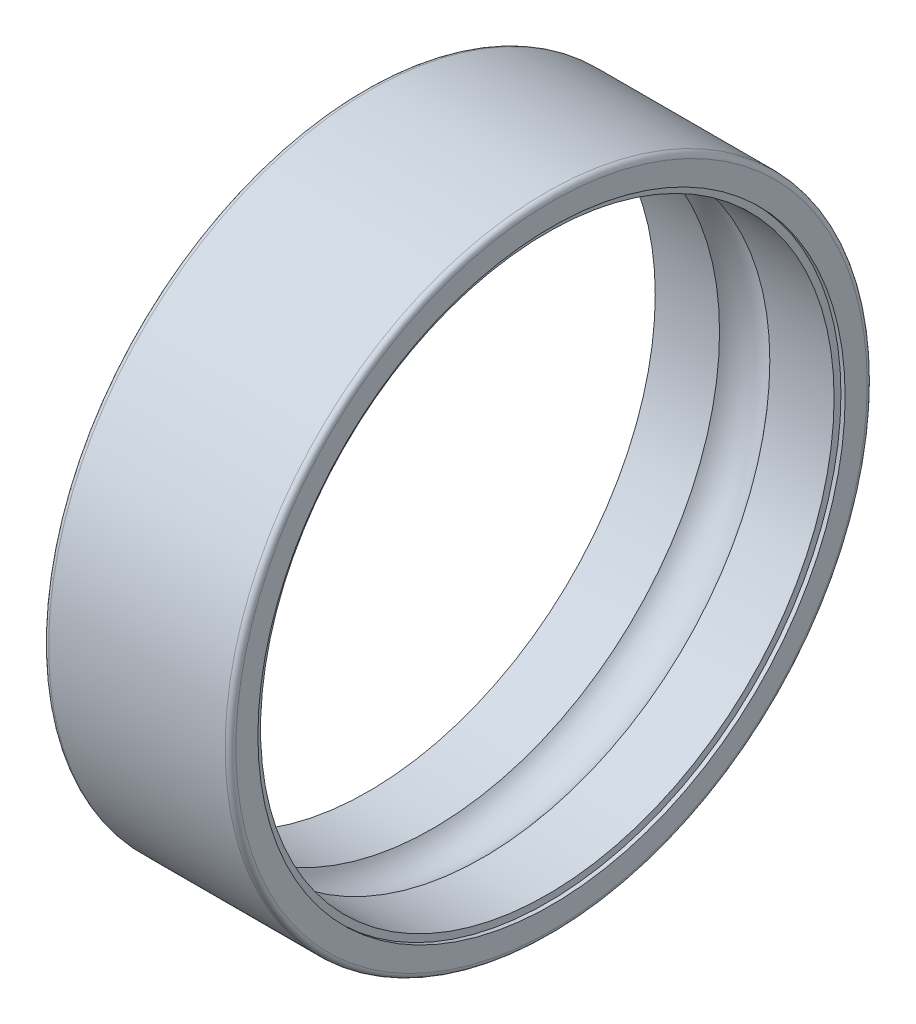
ISO-10303-21;
HEADER;
FILE_DESCRIPTION(('STEP AP214'),'2;1');
FILE_NAME('part.step','',(''),(''),'','','');
FILE_SCHEMA(('AUTOMOTIVE_DESIGN { 1 0 10303 214 1 1 1 1 }'));
ENDSEC;
DATA;
#1=APPLICATION_CONTEXT('core data for automotive mechanical design processes');
#2=APPLICATION_PROTOCOL_DEFINITION('international standard','automotive_design',2000,#1);
#3=PRODUCT_CONTEXT('',#1,'mechanical');
#4=PRODUCT('Part','Part','',(#3));
#5=PRODUCT_RELATED_PRODUCT_CATEGORY('part','',(#4));
#6=PRODUCT_DEFINITION_FORMATION('','',#4);
#7=PRODUCT_DEFINITION_CONTEXT('part definition',#1,'design');
#8=PRODUCT_DEFINITION('design','',#6,#7);
#9=PRODUCT_DEFINITION_SHAPE('','',#8);
#10=(LENGTH_UNIT() NAMED_UNIT(*) SI_UNIT(.MILLI.,.METRE.));
#11=(NAMED_UNIT(*) PLANE_ANGLE_UNIT() SI_UNIT($,.RADIAN.));
#12=(NAMED_UNIT(*) SI_UNIT($,.STERADIAN.) SOLID_ANGLE_UNIT());
#13=UNCERTAINTY_MEASURE_WITH_UNIT(LENGTH_MEASURE(1.E-05),#10,'distance_accuracy_value','');
#14=(GEOMETRIC_REPRESENTATION_CONTEXT(3) GLOBAL_UNCERTAINTY_ASSIGNED_CONTEXT((#13)) GLOBAL_UNIT_ASSIGNED_CONTEXT((#10,
#11,#12)) REPRESENTATION_CONTEXT('',''));
#15=CARTESIAN_POINT('',(0.,0.,0.));
#16=DIRECTION('',(0.,0.,1.));
#17=DIRECTION('',(1.,0.,0.));
#18=AXIS2_PLACEMENT_3D('',#15,#16,#17);
#19=CARTESIAN_POINT('',(0.,5.9,0.));
#20=DIRECTION('',(-1.,0.,0.));
#21=DIRECTION('',(0.,0.,1.));
#22=AXIS2_PLACEMENT_3D('',#19,#20,#21);
#23=PLANE('',#22);
#24=CARTESIAN_POINT('',(0.,0.,0.));
#25=DIRECTION('',(1.,0.,0.));
#26=DIRECTION('',(0.,0.,-1.));
#27=AXIS2_PLACEMENT_3D('',#24,#25,#26);
#28=CIRCLE('',#27,5.488);
#29=CARTESIAN_POINT('',(0.,0.,-5.488));
#30=VERTEX_POINT('',#29);
#31=EDGE_CURVE('E55',#30,#30,#28,.T.);
#32=ORIENTED_EDGE('',*,*,#31,.T.);
#33=EDGE_LOOP('',(#32));
#34=FACE_BOUND('',#33,.T.);
#35=CARTESIAN_POINT('',(0.,0.,0.));
#36=DIRECTION('',(1.,0.,0.));
#37=DIRECTION('',(0.,0.,-1.));
#38=AXIS2_PLACEMENT_3D('',#35,#36,#37);
#39=CIRCLE('',#38,5.89999999578539);
#40=CARTESIAN_POINT('',(0.,0.,-5.89999999578539));
#41=VERTEX_POINT('',#40);
#42=EDGE_CURVE('E52',#41,#41,#39,.T.);
#43=ORIENTED_EDGE('',*,*,#42,.F.);
#44=EDGE_LOOP('',(#43));
#45=FACE_BOUND('',#44,.T.);
#46=ADVANCED_FACE('F14',(#34,#45),#23,.T.);
#47=CARTESIAN_POINT('',(3.5,0.,0.));
#48=DIRECTION('',(1.,0.,0.));
#49=DIRECTION('',(0.,0.,-1.));
#50=AXIS2_PLACEMENT_3D('',#47,#48,#49);
#51=CYLINDRICAL_SURFACE('',#50,5.488);
#52=CARTESIAN_POINT('',(0.0787499999999999,0.,0.));
#53=DIRECTION('',(1.,0.,0.));
#54=DIRECTION('',(0.,0.,-1.));
#55=AXIS2_PLACEMENT_3D('',#52,#53,#54);
#56=CIRCLE('',#55,5.488);
#57=CARTESIAN_POINT('',(0.0787499999999999,0.,-5.488));
#58=VERTEX_POINT('',#57);
#59=EDGE_CURVE('E49',#58,#58,#56,.T.);
#60=ORIENTED_EDGE('',*,*,#59,.T.);
#61=EDGE_LOOP('',(#60));
#62=FACE_BOUND('',#61,.T.);
#63=ORIENTED_EDGE('',*,*,#31,.F.);
#64=EDGE_LOOP('',(#63));
#65=FACE_BOUND('',#64,.T.);
#66=ADVANCED_FACE('F61',(#62,#65),#51,.F.);
#67=CARTESIAN_POINT('',(0.0999999999999217,0.,0.));
#68=DIRECTION('',(1.,0.,0.));
#69=DIRECTION('',(0.,0.,-1.));
#70=AXIS2_PLACEMENT_3D('',#67,#68,#69);
#71=TOROIDAL_SURFACE('',#70,5.90000000000008,0.0999999999999222);
#72=ORIENTED_EDGE('',*,*,#42,.T.);
#73=EDGE_LOOP('',(#72));
#74=FACE_BOUND('',#73,.T.);
#75=CARTESIAN_POINT('',(0.1,0.,0.));
#76=DIRECTION('',(1.,0.,0.));
#77=DIRECTION('',(0.,0.,-1.));
#78=AXIS2_PLACEMENT_3D('',#75,#76,#77);
#79=CIRCLE('',#78,6.);
#80=CARTESIAN_POINT('',(0.1,0.,-6.));
#81=VERTEX_POINT('',#80);
#82=EDGE_CURVE('E46',#81,#81,#79,.T.);
#83=ORIENTED_EDGE('',*,*,#82,.F.);
#84=EDGE_LOOP('',(#83));
#85=FACE_BOUND('',#84,.T.);
#86=ADVANCED_FACE('F63',(#74,#85),#71,.T.);
#87=CARTESIAN_POINT('',(0.07875,5.488,0.));
#88=DIRECTION('',(-1.,0.,0.));
#89=DIRECTION('',(0.,0.,1.));
#90=AXIS2_PLACEMENT_3D('',#87,#88,#89);
#91=PLANE('',#90);
#92=CARTESIAN_POINT('',(0.0787499999999999,0.,0.));
#93=DIRECTION('',(1.,0.,0.));
#94=DIRECTION('',(0.,0.,-1.));
#95=AXIS2_PLACEMENT_3D('',#92,#93,#94);
#96=CIRCLE('',#95,5.36);
#97=CARTESIAN_POINT('',(0.0787499999999999,0.,-5.36));
#98=VERTEX_POINT('',#97);
#99=EDGE_CURVE('E43',#98,#98,#96,.T.);
#100=ORIENTED_EDGE('',*,*,#99,.T.);
#101=EDGE_LOOP('',(#100));
#102=FACE_BOUND('',#101,.T.);
#103=ORIENTED_EDGE('',*,*,#59,.F.);
#104=EDGE_LOOP('',(#103));
#105=FACE_BOUND('',#104,.T.);
#106=ADVANCED_FACE('F71',(#102,#105),#91,.T.);
#107=CARTESIAN_POINT('',(3.5,0.,0.));
#108=DIRECTION('',(1.,0.,0.));
#109=DIRECTION('',(0.,0.,-1.));
#110=AXIS2_PLACEMENT_3D('',#107,#108,#109);
#111=CYLINDRICAL_SURFACE('',#110,6.);
#112=ORIENTED_EDGE('',*,*,#82,.T.);
#113=EDGE_LOOP('',(#112));
#114=FACE_BOUND('',#113,.T.);
#115=CARTESIAN_POINT('',(3.4,0.,0.));
#116=DIRECTION('',(1.,0.,0.));
#117=DIRECTION('',(0.,0.,-1.));
#118=AXIS2_PLACEMENT_3D('',#115,#116,#117);
#119=CIRCLE('',#118,6.);
#120=CARTESIAN_POINT('',(3.4,0.,-6.));
#121=VERTEX_POINT('',#120);
#122=EDGE_CURVE('E40',#121,#121,#119,.T.);
#123=ORIENTED_EDGE('',*,*,#122,.F.);
#124=EDGE_LOOP('',(#123));
#125=FACE_BOUND('',#124,.T.);
#126=ADVANCED_FACE('F78',(#114,#125),#111,.T.);
#127=CARTESIAN_POINT('',(3.5,0.,0.));
#128=DIRECTION('',(1.,0.,0.));
#129=DIRECTION('',(0.,0.,-1.));
#130=AXIS2_PLACEMENT_3D('',#127,#128,#129);
#131=CYLINDRICAL_SURFACE('',#130,5.36);
#132=CARTESIAN_POINT('',(1.2800382994328,0.,0.));
#133=DIRECTION('',(1.,0.,0.));
#134=DIRECTION('',(0.,0.,-1.));
#135=AXIS2_PLACEMENT_3D('',#132,#133,#134);
#136=CIRCLE('',#135,5.36);
#137=CARTESIAN_POINT('',(1.2800382994328,0.,-5.36));
#138=VERTEX_POINT('',#137);
#139=EDGE_CURVE('E37',#138,#138,#136,.T.);
#140=ORIENTED_EDGE('',*,*,#139,.T.);
#141=EDGE_LOOP('',(#140));
#142=FACE_BOUND('',#141,.T.);
#143=ORIENTED_EDGE('',*,*,#99,.F.);
#144=EDGE_LOOP('',(#143));
#145=FACE_BOUND('',#144,.T.);
#146=ADVANCED_FACE('F82',(#142,#145),#131,.F.);
#147=CARTESIAN_POINT('',(3.40000000000015,0.,0.));
#148=DIRECTION('',(1.,0.,0.));
#149=DIRECTION('',(0.,0.,-1.));
#150=AXIS2_PLACEMENT_3D('',#147,#148,#149);
#151=TOROIDAL_SURFACE('',#150,5.90000000000016,0.099999999999845);
#152=ORIENTED_EDGE('',*,*,#122,.T.);
#153=EDGE_LOOP('',(#152));
#154=FACE_BOUND('',#153,.T.);
#155=CARTESIAN_POINT('',(3.5,0.,0.));
#156=DIRECTION('',(1.,0.,0.));
#157=DIRECTION('',(0.,0.,-1.));
#158=AXIS2_PLACEMENT_3D('',#155,#156,#157);
#159=CIRCLE('',#158,5.90000000000016);
#160=CARTESIAN_POINT('',(3.5,0.,-5.90000000000016));
#161=VERTEX_POINT('',#160);
#162=EDGE_CURVE('E34',#161,#161,#159,.T.);
#163=ORIENTED_EDGE('',*,*,#162,.F.);
#164=EDGE_LOOP('',(#163));
#165=FACE_BOUND('',#164,.T.);
#166=ADVANCED_FACE('F86',(#154,#165),#151,.T.);
#167=CARTESIAN_POINT('',(1.75,0.,0.));
#168=DIRECTION('',(1.,0.,0.));
#169=DIRECTION('',(0.,0.,-1.));
#170=AXIS2_PLACEMENT_3D('',#167,#168,#169);
#171=TOROIDAL_SURFACE('',#170,5.,0.592000000000032);
#172=ORIENTED_EDGE('',*,*,#139,.F.);
#173=EDGE_LOOP('',(#172));
#174=FACE_BOUND('',#173,.T.);
#175=CARTESIAN_POINT('',(2.2199617005672,0.,0.));
#176=DIRECTION('',(1.,0.,0.));
#177=DIRECTION('',(0.,0.,-1.));
#178=AXIS2_PLACEMENT_3D('',#175,#176,#177);
#179=CIRCLE('',#178,5.36);
#180=CARTESIAN_POINT('',(2.2199617005672,0.,-5.36));
#181=VERTEX_POINT('',#180);
#182=EDGE_CURVE('E29',#181,#181,#179,.T.);
#183=ORIENTED_EDGE('',*,*,#182,.T.);
#184=EDGE_LOOP('',(#183));
#185=FACE_BOUND('',#184,.T.);
#186=ADVANCED_FACE('F90',(#174,#185),#171,.F.);
#187=CARTESIAN_POINT('',(3.5,5.488,0.));
#188=DIRECTION('',(1.,0.,0.));
#189=DIRECTION('',(0.,0.,-1.));
#190=AXIS2_PLACEMENT_3D('',#187,#188,#189);
#191=PLANE('',#190);
#192=ORIENTED_EDGE('',*,*,#162,.T.);
#193=EDGE_LOOP('',(#192));
#194=FACE_BOUND('',#193,.T.);
#195=CARTESIAN_POINT('',(3.5,0.,0.));
#196=DIRECTION('',(1.,0.,0.));
#197=DIRECTION('',(0.,0.,-1.));
#198=AXIS2_PLACEMENT_3D('',#195,#196,#197);
#199=CIRCLE('',#198,5.488);
#200=CARTESIAN_POINT('',(3.5,0.,-5.488));
#201=VERTEX_POINT('',#200);
#202=EDGE_CURVE('E25',#201,#201,#199,.T.);
#203=ORIENTED_EDGE('',*,*,#202,.F.);
#204=EDGE_LOOP('',(#203));
#205=FACE_BOUND('',#204,.T.);
#206=ADVANCED_FACE('F94',(#194,#205),#191,.T.);
#207=CARTESIAN_POINT('',(3.5,0.,0.));
#208=DIRECTION('',(1.,0.,0.));
#209=DIRECTION('',(0.,0.,-1.));
#210=AXIS2_PLACEMENT_3D('',#207,#208,#209);
#211=CYLINDRICAL_SURFACE('',#210,5.36);
#212=CARTESIAN_POINT('',(3.42125,0.,0.));
#213=DIRECTION('',(1.,0.,0.));
#214=DIRECTION('',(0.,0.,-1.));
#215=AXIS2_PLACEMENT_3D('',#212,#213,#214);
#216=CIRCLE('',#215,5.36);
#217=CARTESIAN_POINT('',(3.42125,0.,-5.36));
#218=VERTEX_POINT('',#217);
#219=EDGE_CURVE('E21',#218,#218,#216,.T.);
#220=ORIENTED_EDGE('',*,*,#219,.T.);
#221=EDGE_LOOP('',(#220));
#222=FACE_BOUND('',#221,.T.);
#223=ORIENTED_EDGE('',*,*,#182,.F.);
#224=EDGE_LOOP('',(#223));
#225=FACE_BOUND('',#224,.T.);
#226=ADVANCED_FACE('F98',(#222,#225),#211,.F.);
#227=CARTESIAN_POINT('',(3.5,0.,0.));
#228=DIRECTION('',(1.,0.,0.));
#229=DIRECTION('',(0.,0.,-1.));
#230=AXIS2_PLACEMENT_3D('',#227,#228,#229);
#231=CYLINDRICAL_SURFACE('',#230,5.488);
#232=ORIENTED_EDGE('',*,*,#202,.T.);
#233=EDGE_LOOP('',(#232));
#234=FACE_BOUND('',#233,.T.);
#235=CARTESIAN_POINT('',(3.42125,0.,0.));
#236=DIRECTION('',(1.,0.,0.));
#237=DIRECTION('',(0.,0.,-1.));
#238=AXIS2_PLACEMENT_3D('',#235,#236,#237);
#239=CIRCLE('',#238,5.488);
#240=CARTESIAN_POINT('',(3.42125,0.,-5.488));
#241=VERTEX_POINT('',#240);
#242=EDGE_CURVE('E10',#241,#241,#239,.T.);
#243=ORIENTED_EDGE('',*,*,#242,.F.);
#244=EDGE_LOOP('',(#243));
#245=FACE_BOUND('',#244,.T.);
#246=ADVANCED_FACE('F101',(#234,#245),#231,.F.);
#247=CARTESIAN_POINT('',(3.42125,5.36,0.));
#248=DIRECTION('',(1.,0.,0.));
#249=DIRECTION('',(0.,0.,-1.));
#250=AXIS2_PLACEMENT_3D('',#247,#248,#249);
#251=PLANE('',#250);
#252=ORIENTED_EDGE('',*,*,#242,.T.);
#253=EDGE_LOOP('',(#252));
#254=FACE_BOUND('',#253,.T.);
#255=ORIENTED_EDGE('',*,*,#219,.F.);
#256=EDGE_LOOP('',(#255));
#257=FACE_BOUND('',#256,.T.);
#258=ADVANCED_FACE('F16',(#254,#257),#251,.T.);
#259=CLOSED_SHELL('',(#46,#66,#86,#106,#126,#146,#166,#186,#206,#226,#246,#258));
#260=MANIFOLD_SOLID_BREP('B1',#259);
#261=ADVANCED_BREP_SHAPE_REPRESENTATION('',(#18,#260),#14);
#262=SHAPE_DEFINITION_REPRESENTATION(#9,#261);
ENDSEC;
END-ISO-10303-21;
